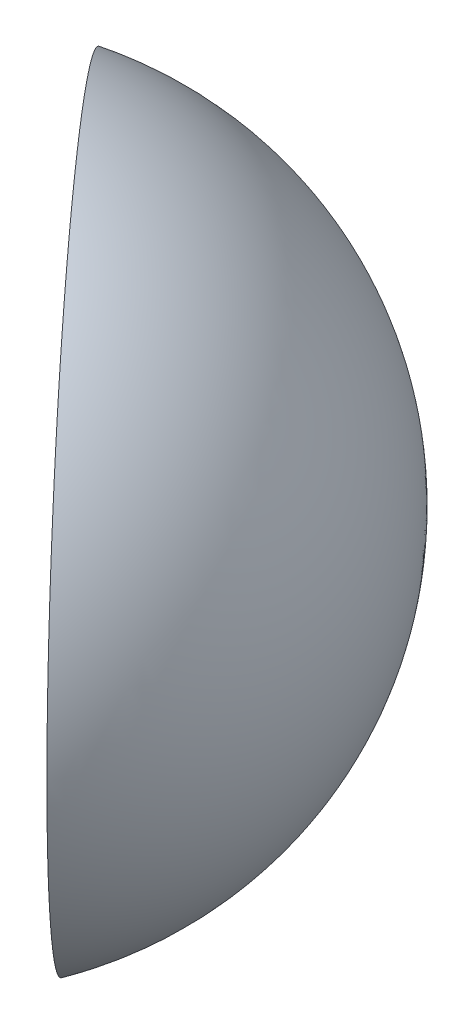
ISO-10303-21;
HEADER;
FILE_DESCRIPTION(('STEP AP214'),'2;1');
FILE_NAME('part.step','',(''),(''),'','','');
FILE_SCHEMA(('AUTOMOTIVE_DESIGN { 1 0 10303 214 1 1 1 1 }'));
ENDSEC;
DATA;
#1=APPLICATION_CONTEXT('core data for automotive mechanical design processes');
#2=APPLICATION_PROTOCOL_DEFINITION('international standard','automotive_design',2000,#1);
#3=PRODUCT_CONTEXT('',#1,'mechanical');
#4=PRODUCT('Part','Part','',(#3));
#5=PRODUCT_RELATED_PRODUCT_CATEGORY('part','',(#4));
#6=PRODUCT_DEFINITION_FORMATION('','',#4);
#7=PRODUCT_DEFINITION_CONTEXT('part definition',#1,'design');
#8=PRODUCT_DEFINITION('design','',#6,#7);
#9=PRODUCT_DEFINITION_SHAPE('','',#8);
#10=(LENGTH_UNIT() NAMED_UNIT(*) SI_UNIT(.MILLI.,.METRE.));
#11=(NAMED_UNIT(*) PLANE_ANGLE_UNIT() SI_UNIT($,.RADIAN.));
#12=(NAMED_UNIT(*) SI_UNIT($,.STERADIAN.) SOLID_ANGLE_UNIT());
#13=UNCERTAINTY_MEASURE_WITH_UNIT(LENGTH_MEASURE(1.E-05),#10,'distance_accuracy_value','');
#14=(GEOMETRIC_REPRESENTATION_CONTEXT(3) GLOBAL_UNCERTAINTY_ASSIGNED_CONTEXT((#13)) GLOBAL_UNIT_ASSIGNED_CONTEXT((#10,
#11,#12)) REPRESENTATION_CONTEXT('',''));
#15=CARTESIAN_POINT('',(0.,0.,0.));
#16=DIRECTION('',(0.,0.,1.));
#17=DIRECTION('',(1.,0.,0.));
#18=AXIS2_PLACEMENT_3D('',#15,#16,#17);
#19=CARTESIAN_POINT('',(-13.4034178847262,0.,-21.675895182338));
#20=DIRECTION('',(0.754798938275913,0.,-0.655956220168355));
#21=DIRECTION('',(-0.655956220168355,0.,-0.754798938275913));
#22=AXIS2_PLACEMENT_3D('',#19,#20,#21);
#23=PLANE('',#22);
#24=CARTESIAN_POINT('',(-12.4608426997659,0.,-20.5912881201919));
#25=DIRECTION('',(-0.754798938275913,0.,0.655956220168355));
#26=DIRECTION('',(0.655956220168355,0.,0.754798938275913));
#27=AXIS2_PLACEMENT_3D('',#24,#25,#26);
#28=CIRCLE('',#27,1.4369483145054);
#29=CARTESIAN_POINT('',(-11.5182675148057,0.,-19.5066810580459));
#30=VERTEX_POINT('',#29);
#31=EDGE_CURVE('E13',#30,#30,#28,.T.);
#32=ORIENTED_EDGE('',*,*,#31,.T.);
#33=EDGE_LOOP('',(#32));
#34=FACE_BOUND('',#33,.T.);
#35=ADVANCED_FACE('F42',(#34),#23,.F.);
#36=CARTESIAN_POINT('',(-12.7787929707794,0.,-20.309532865286));
#37=DIRECTION('',(0.,-1.,0.));
#38=DIRECTION('',(0.655956220168355,0.,0.754798938275913));
#39=AXIS2_PLACEMENT_3D('',#36,#37,#38);
#40=CIRCLE('',#39,1.49448835711303);
#41=TRIMMED_CURVE('',#40,(PARAMETER_VALUE(-1.57354450106567)),
(PARAMETER_VALUE(1.57354450106567)),.T.,.PARAMETER.);
#42=CARTESIAN_POINT('',(-12.7814870546593,0.,-20.3126329070108));
#43=DIRECTION('',(-0.754798938275913,0.,0.655956220168355));
#44=AXIS1_PLACEMENT('',#42,#43);
#45=SURFACE_OF_REVOLUTION('',#41,#44);
#46=ORIENTED_EDGE('',*,*,#31,.F.);
#47=EDGE_LOOP('',(#46));
#48=FACE_BOUND('',#47,.T.);
#49=CARTESIAN_POINT('',(-11.6534530891748,0.,-21.2929481389199));
#50=VERTEX_POINT('',#49);
#51=VERTEX_LOOP('',#50);
#52=FACE_BOUND('',#51,.T.);
#53=ADVANCED_FACE('F49',(#48,#52),#45,.T.);
#54=CLOSED_SHELL('',(#35,#53));
#55=MANIFOLD_SOLID_BREP('B2',#54);
#56=ADVANCED_BREP_SHAPE_REPRESENTATION('',(#18,#55),#14);
#57=SHAPE_DEFINITION_REPRESENTATION(#9,#56);
ENDSEC;
END-ISO-10303-21;
